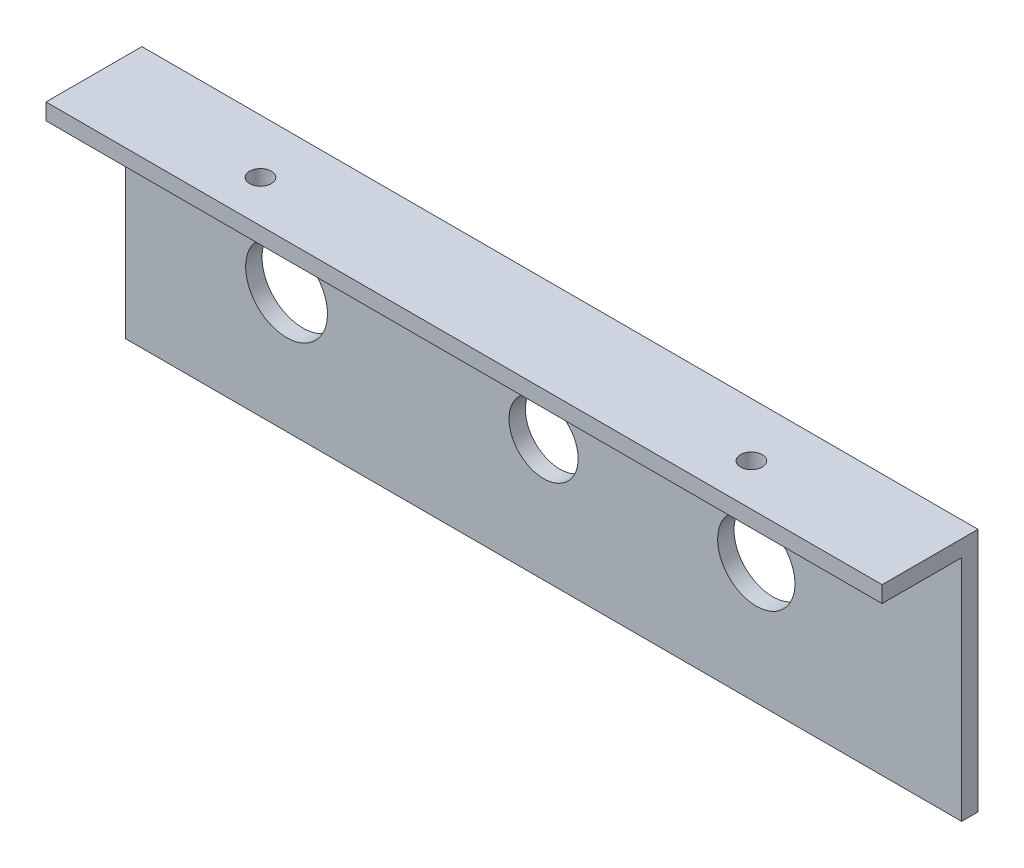
ISO-10303-21;
HEADER;
FILE_DESCRIPTION(('STEP AP214'),'2;1');
FILE_NAME('part.step','',(''),(''),'','','');
FILE_SCHEMA(('AUTOMOTIVE_DESIGN { 1 0 10303 214 1 1 1 1 }'));
ENDSEC;
DATA;
#1=APPLICATION_CONTEXT('core data for automotive mechanical design processes');
#2=APPLICATION_PROTOCOL_DEFINITION('international standard','automotive_design',2000,#1);
#3=PRODUCT_CONTEXT('',#1,'mechanical');
#4=PRODUCT('Part','Part','',(#3));
#5=PRODUCT_RELATED_PRODUCT_CATEGORY('part','',(#4));
#6=PRODUCT_DEFINITION_FORMATION('','',#4);
#7=PRODUCT_DEFINITION_CONTEXT('part definition',#1,'design');
#8=PRODUCT_DEFINITION('design','',#6,#7);
#9=PRODUCT_DEFINITION_SHAPE('','',#8);
#10=(LENGTH_UNIT() NAMED_UNIT(*) SI_UNIT(.MILLI.,.METRE.));
#11=(NAMED_UNIT(*) PLANE_ANGLE_UNIT() SI_UNIT($,.RADIAN.));
#12=(NAMED_UNIT(*) SI_UNIT($,.STERADIAN.) SOLID_ANGLE_UNIT());
#13=UNCERTAINTY_MEASURE_WITH_UNIT(LENGTH_MEASURE(1.E-05),#10,'distance_accuracy_value','');
#14=(GEOMETRIC_REPRESENTATION_CONTEXT(3) GLOBAL_UNCERTAINTY_ASSIGNED_CONTEXT((#13)) GLOBAL_UNIT_ASSIGNED_CONTEXT((#10,
#11,#12)) REPRESENTATION_CONTEXT('',''));
#15=CARTESIAN_POINT('',(0.,0.,0.));
#16=DIRECTION('',(0.,0.,1.));
#17=DIRECTION('',(1.,0.,0.));
#18=AXIS2_PLACEMENT_3D('',#15,#16,#17);
#19=CARTESIAN_POINT('',(0.,0.,2.54));
#20=DIRECTION('',(0.,0.,1.));
#21=DIRECTION('',(1.,0.,0.));
#22=AXIS2_PLACEMENT_3D('',#19,#20,#21);
#23=PLANE('',#22);
#24=CARTESIAN_POINT('',(33.02,0.,2.54));
#25=DIRECTION('',(0.,0.,-1.));
#26=DIRECTION('',(-1.,0.,0.));
#27=AXIS2_PLACEMENT_3D('',#24,#25,#26);
#28=CIRCLE('',#27,6.);
#29=CARTESIAN_POINT('',(27.02,0.,2.54));
#30=VERTEX_POINT('',#29);
#31=EDGE_CURVE('E304',#30,#30,#28,.T.);
#32=ORIENTED_EDGE('',*,*,#31,.T.);
#33=EDGE_LOOP('',(#32));
#34=FACE_BOUND('',#33,.T.);
#35=CARTESIAN_POINT('',(-39.897,0.,2.54));
#36=DIRECTION('',(0.,0.,1.));
#37=DIRECTION('',(1.,0.,0.));
#38=AXIS2_PLACEMENT_3D('',#35,#36,#37);
#39=CIRCLE('',#38,6.34999999999994);
#40=CARTESIAN_POINT('',(-33.5470000000001,0.,2.54));
#41=VERTEX_POINT('',#40);
#42=EDGE_CURVE('E135',#41,#41,#39,.T.);
#43=ORIENTED_EDGE('',*,*,#42,.F.);
#44=EDGE_LOOP('',(#43));
#45=FACE_BOUND('',#44,.T.);
#46=CARTESIAN_POINT('',(0.,0.,2.54));
#47=DIRECTION('',(0.,0.,1.));
#48=DIRECTION('',(1.,0.,0.));
#49=AXIS2_PLACEMENT_3D('',#46,#47,#48);
#50=CIRCLE('',#49,5.36575);
#51=CARTESIAN_POINT('',(5.36575,0.,2.54));
#52=VERTEX_POINT('',#51);
#53=EDGE_CURVE('E125',#52,#52,#50,.T.);
#54=ORIENTED_EDGE('',*,*,#53,.F.);
#55=EDGE_LOOP('',(#54));
#56=FACE_BOUND('',#55,.T.);
#57=DIRECTION('',(0.,-1.,0.));
#58=VECTOR('',#57,1.);
#59=CARTESIAN_POINT('',(64.897,18.9992,2.54));
#60=LINE('',#59,#58);
#61=CARTESIAN_POINT('',(64.897,16.4592,2.54));
#62=VERTEX_POINT('',#61);
#63=CARTESIAN_POINT('',(64.897,-18.9992,2.54));
#64=VERTEX_POINT('',#63);
#65=EDGE_CURVE('E65',#62,#64,#60,.T.);
#66=ORIENTED_EDGE('',*,*,#65,.F.);
#67=DIRECTION('',(-1.,0.,0.));
#68=VECTOR('',#67,1.);
#69=CARTESIAN_POINT('',(64.897,16.4592,2.54));
#70=LINE('',#69,#68);
#71=CARTESIAN_POINT('',(-64.897,16.4592,2.54));
#72=VERTEX_POINT('',#71);
#73=EDGE_CURVE('E149',#62,#72,#70,.T.);
#74=ORIENTED_EDGE('',*,*,#73,.T.);
#75=DIRECTION('',(0.,-1.,0.));
#76=VECTOR('',#75,1.);
#77=CARTESIAN_POINT('',(-64.897,18.9992,2.54));
#78=LINE('',#77,#76);
#79=CARTESIAN_POINT('',(-64.897,-18.9992,2.54));
#80=VERTEX_POINT('',#79);
#81=EDGE_CURVE('E110',#72,#80,#78,.T.);
#82=ORIENTED_EDGE('',*,*,#81,.T.);
#83=DIRECTION('',(1.,0.,0.));
#84=VECTOR('',#83,1.);
#85=CARTESIAN_POINT('',(-64.897,-18.9992,2.54));
#86=LINE('',#85,#84);
#87=EDGE_CURVE('E113',#80,#64,#86,.T.);
#88=ORIENTED_EDGE('',*,*,#87,.T.);
#89=EDGE_LOOP('',(#66,#74,#82,#88));
#90=FACE_BOUND('',#89,.T.);
#91=ADVANCED_FACE('F39',(#34,#45,#56,#90),#23,.T.);
#92=CARTESIAN_POINT('',(-64.897,18.9992,2.54));
#93=DIRECTION('',(1.,0.,0.));
#94=DIRECTION('',(0.,0.,-1.));
#95=AXIS2_PLACEMENT_3D('',#92,#93,#94);
#96=PLANE('',#95);
#97=DIRECTION('',(0.,-1.,0.));
#98=VECTOR('',#97,1.);
#99=CARTESIAN_POINT('',(-64.897,18.9992,0.));
#100=LINE('',#99,#98);
#101=CARTESIAN_POINT('',(-64.897,18.9992,0.));
#102=VERTEX_POINT('',#101);
#103=CARTESIAN_POINT('',(-64.897,-18.9992,0.));
#104=VERTEX_POINT('',#103);
#105=EDGE_CURVE('E88',#102,#104,#100,.T.);
#106=ORIENTED_EDGE('',*,*,#105,.T.);
#107=DIRECTION('',(0.,0.,-1.));
#108=VECTOR('',#107,1.);
#109=CARTESIAN_POINT('',(-64.897,-18.9992,2.54));
#110=LINE('',#109,#108);
#111=EDGE_CURVE('E11',#80,#104,#110,.T.);
#112=ORIENTED_EDGE('',*,*,#111,.F.);
#113=ORIENTED_EDGE('',*,*,#81,.F.);
#114=DIRECTION('',(0.,0.,1.));
#115=VECTOR('',#114,1.);
#116=CARTESIAN_POINT('',(-64.897,16.4592,2.54));
#117=LINE('',#116,#115);
#118=CARTESIAN_POINT('',(-64.897,16.4592,14.8844));
#119=VERTEX_POINT('',#118);
#120=EDGE_CURVE('E56',#72,#119,#117,.T.);
#121=ORIENTED_EDGE('',*,*,#120,.T.);
#122=DIRECTION('',(0.,-1.,0.));
#123=VECTOR('',#122,1.);
#124=CARTESIAN_POINT('',(-64.897,18.9992,14.8844));
#125=LINE('',#124,#123);
#126=CARTESIAN_POINT('',(-64.897,18.9992,14.8844));
#127=VERTEX_POINT('',#126);
#128=EDGE_CURVE('E91',#127,#119,#125,.T.);
#129=ORIENTED_EDGE('',*,*,#128,.F.);
#130=DIRECTION('',(0.,0.,-1.));
#131=VECTOR('',#130,1.);
#132=CARTESIAN_POINT('',(-64.897,18.9992,2.54));
#133=LINE('',#132,#131);
#134=EDGE_CURVE('E85',#127,#102,#133,.T.);
#135=ORIENTED_EDGE('',*,*,#134,.T.);
#136=EDGE_LOOP('',(#106,#112,#113,#121,#129,#135));
#137=FACE_BOUND('',#136,.T.);
#138=ADVANCED_FACE('F41',(#137),#96,.F.);
#139=CARTESIAN_POINT('',(-64.897,-18.9992,2.54));
#140=DIRECTION('',(0.,1.,0.));
#141=DIRECTION('',(0.,0.,1.));
#142=AXIS2_PLACEMENT_3D('',#139,#140,#141);
#143=PLANE('',#142);
#144=DIRECTION('',(1.,0.,0.));
#145=VECTOR('',#144,1.);
#146=CARTESIAN_POINT('',(-64.897,-18.9992,0.));
#147=LINE('',#146,#145);
#148=CARTESIAN_POINT('',(64.897,-18.9992,0.));
#149=VERTEX_POINT('',#148);
#150=EDGE_CURVE('E104',#104,#149,#147,.T.);
#151=ORIENTED_EDGE('',*,*,#150,.T.);
#152=DIRECTION('',(0.,0.,-1.));
#153=VECTOR('',#152,1.);
#154=CARTESIAN_POINT('',(64.897,-18.9992,2.54));
#155=LINE('',#154,#153);
#156=EDGE_CURVE('E48',#64,#149,#155,.T.);
#157=ORIENTED_EDGE('',*,*,#156,.F.);
#158=ORIENTED_EDGE('',*,*,#87,.F.);
#159=ORIENTED_EDGE('',*,*,#111,.T.);
#160=EDGE_LOOP('',(#151,#157,#158,#159));
#161=FACE_BOUND('',#160,.T.);
#162=ADVANCED_FACE('F159',(#161),#143,.F.);
#163=CARTESIAN_POINT('',(64.897,18.9992,2.54));
#164=DIRECTION('',(1.,0.,0.));
#165=DIRECTION('',(0.,0.,-1.));
#166=AXIS2_PLACEMENT_3D('',#163,#164,#165);
#167=PLANE('',#166);
#168=DIRECTION('',(0.,-1.,0.));
#169=VECTOR('',#168,1.);
#170=CARTESIAN_POINT('',(64.897,18.9992,0.));
#171=LINE('',#170,#169);
#172=CARTESIAN_POINT('',(64.897,18.9992,0.));
#173=VERTEX_POINT('',#172);
#174=EDGE_CURVE('E111',#173,#149,#171,.T.);
#175=ORIENTED_EDGE('',*,*,#174,.F.);
#176=DIRECTION('',(0.,0.,-1.));
#177=VECTOR('',#176,1.);
#178=CARTESIAN_POINT('',(64.897,18.9992,2.54));
#179=LINE('',#178,#177);
#180=CARTESIAN_POINT('',(64.897,18.9992,14.8844));
#181=VERTEX_POINT('',#180);
#182=EDGE_CURVE('E96',#181,#173,#179,.T.);
#183=ORIENTED_EDGE('',*,*,#182,.F.);
#184=DIRECTION('',(0.,-1.,0.));
#185=VECTOR('',#184,1.);
#186=CARTESIAN_POINT('',(64.897,18.9992,14.8844));
#187=LINE('',#186,#185);
#188=CARTESIAN_POINT('',(64.897,16.4592,14.8844));
#189=VERTEX_POINT('',#188);
#190=EDGE_CURVE('E146',#181,#189,#187,.T.);
#191=ORIENTED_EDGE('',*,*,#190,.T.);
#192=DIRECTION('',(0.,0.,1.));
#193=VECTOR('',#192,1.);
#194=CARTESIAN_POINT('',(64.897,16.4592,2.54));
#195=LINE('',#194,#193);
#196=EDGE_CURVE('E143',#62,#189,#195,.T.);
#197=ORIENTED_EDGE('',*,*,#196,.F.);
#198=ORIENTED_EDGE('',*,*,#65,.T.);
#199=ORIENTED_EDGE('',*,*,#156,.T.);
#200=EDGE_LOOP('',(#175,#183,#191,#197,#198,#199));
#201=FACE_BOUND('',#200,.T.);
#202=ADVANCED_FACE('F161',(#201),#167,.T.);
#203=CARTESIAN_POINT('',(-64.897,18.9992,2.54));
#204=DIRECTION('',(0.,1.,0.));
#205=DIRECTION('',(0.,0.,1.));
#206=AXIS2_PLACEMENT_3D('',#203,#204,#205);
#207=PLANE('',#206);
#208=CARTESIAN_POINT('',(-38.1,18.9992,8.382));
#209=DIRECTION('',(0.,1.,0.));
#210=DIRECTION('',(0.,0.,1.));
#211=AXIS2_PLACEMENT_3D('',#208,#209,#210);
#212=CIRCLE('',#211,1.68275);
#213=CARTESIAN_POINT('',(-38.1,18.9992,10.06475));
#214=VERTEX_POINT('',#213);
#215=EDGE_CURVE('E121',#214,#214,#212,.T.);
#216=ORIENTED_EDGE('',*,*,#215,.F.);
#217=EDGE_LOOP('',(#216));
#218=FACE_BOUND('',#217,.T.);
#219=CARTESIAN_POINT('',(38.1,18.9992,8.382));
#220=DIRECTION('',(0.,1.,0.));
#221=DIRECTION('',(0.,0.,1.));
#222=AXIS2_PLACEMENT_3D('',#219,#220,#221);
#223=CIRCLE('',#222,1.68275);
#224=CARTESIAN_POINT('',(38.1,18.9992,10.06475));
#225=VERTEX_POINT('',#224);
#226=EDGE_CURVE('E127',#225,#225,#223,.T.);
#227=ORIENTED_EDGE('',*,*,#226,.F.);
#228=EDGE_LOOP('',(#227));
#229=FACE_BOUND('',#228,.T.);
#230=DIRECTION('',(1.,0.,0.));
#231=VECTOR('',#230,1.);
#232=CARTESIAN_POINT('',(-64.897,18.9992,0.));
#233=LINE('',#232,#231);
#234=EDGE_CURVE('E102',#102,#173,#233,.T.);
#235=ORIENTED_EDGE('',*,*,#234,.F.);
#236=ORIENTED_EDGE('',*,*,#134,.F.);
#237=DIRECTION('',(-1.,0.,0.));
#238=VECTOR('',#237,1.);
#239=CARTESIAN_POINT('',(64.897,18.9992,14.8844));
#240=LINE('',#239,#238);
#241=EDGE_CURVE('E105',#181,#127,#240,.T.);
#242=ORIENTED_EDGE('',*,*,#241,.F.);
#243=ORIENTED_EDGE('',*,*,#182,.T.);
#244=EDGE_LOOP('',(#235,#236,#242,#243));
#245=FACE_BOUND('',#244,.T.);
#246=ADVANCED_FACE('F107',(#218,#229,#245),#207,.T.);
#247=CARTESIAN_POINT('',(0.,0.,0.));
#248=DIRECTION('',(0.,0.,1.));
#249=DIRECTION('',(1.,0.,0.));
#250=AXIS2_PLACEMENT_3D('',#247,#248,#249);
#251=PLANE('',#250);
#252=CARTESIAN_POINT('',(33.02,0.,0.));
#253=DIRECTION('',(0.,0.,-1.));
#254=DIRECTION('',(-1.,0.,0.));
#255=AXIS2_PLACEMENT_3D('',#252,#253,#254);
#256=CIRCLE('',#255,6.);
#257=CARTESIAN_POINT('',(27.02,0.,0.));
#258=VERTEX_POINT('',#257);
#259=EDGE_CURVE('E307',#258,#258,#256,.T.);
#260=ORIENTED_EDGE('',*,*,#259,.F.);
#261=EDGE_LOOP('',(#260));
#262=FACE_BOUND('',#261,.T.);
#263=CARTESIAN_POINT('',(-39.897,0.,0.));
#264=DIRECTION('',(0.,0.,1.));
#265=DIRECTION('',(1.,0.,0.));
#266=AXIS2_PLACEMENT_3D('',#263,#264,#265);
#267=CIRCLE('',#266,6.34999999999994);
#268=CARTESIAN_POINT('',(-33.5470000000001,0.,0.));
#269=VERTEX_POINT('',#268);
#270=EDGE_CURVE('E132',#269,#269,#267,.T.);
#271=ORIENTED_EDGE('',*,*,#270,.T.);
#272=EDGE_LOOP('',(#271));
#273=FACE_BOUND('',#272,.T.);
#274=CARTESIAN_POINT('',(0.,0.,0.));
#275=DIRECTION('',(0.,0.,1.));
#276=DIRECTION('',(1.,0.,0.));
#277=AXIS2_PLACEMENT_3D('',#274,#275,#276);
#278=CIRCLE('',#277,5.36575);
#279=CARTESIAN_POINT('',(5.36575,0.,0.));
#280=VERTEX_POINT('',#279);
#281=EDGE_CURVE('E138',#280,#280,#278,.T.);
#282=ORIENTED_EDGE('',*,*,#281,.T.);
#283=EDGE_LOOP('',(#282));
#284=FACE_BOUND('',#283,.T.);
#285=ORIENTED_EDGE('',*,*,#105,.F.);
#286=ORIENTED_EDGE('',*,*,#234,.T.);
#287=ORIENTED_EDGE('',*,*,#174,.T.);
#288=ORIENTED_EDGE('',*,*,#150,.F.);
#289=EDGE_LOOP('',(#285,#286,#287,#288));
#290=FACE_BOUND('',#289,.T.);
#291=ADVANCED_FACE('F100',(#262,#273,#284,#290),#251,.F.);
#292=CARTESIAN_POINT('',(64.897,18.9992,14.8844));
#293=DIRECTION('',(0.,0.,-1.));
#294=DIRECTION('',(-1.,0.,0.));
#295=AXIS2_PLACEMENT_3D('',#292,#293,#294);
#296=PLANE('',#295);
#297=ORIENTED_EDGE('',*,*,#128,.T.);
#298=DIRECTION('',(-1.,0.,0.));
#299=VECTOR('',#298,1.);
#300=CARTESIAN_POINT('',(64.897,16.4592,14.8844));
#301=LINE('',#300,#299);
#302=EDGE_CURVE('E153',#189,#119,#301,.T.);
#303=ORIENTED_EDGE('',*,*,#302,.F.);
#304=ORIENTED_EDGE('',*,*,#190,.F.);
#305=ORIENTED_EDGE('',*,*,#241,.T.);
#306=EDGE_LOOP('',(#297,#303,#304,#305));
#307=FACE_BOUND('',#306,.T.);
#308=ADVANCED_FACE('F167',(#307),#296,.F.);
#309=CARTESIAN_POINT('',(64.897,16.4592,2.54));
#310=DIRECTION('',(0.,-1.,0.));
#311=DIRECTION('',(0.,0.,-1.));
#312=AXIS2_PLACEMENT_3D('',#309,#310,#311);
#313=PLANE('',#312);
#314=CARTESIAN_POINT('',(-38.1,16.4592,8.382));
#315=DIRECTION('',(0.,-1.,0.));
#316=DIRECTION('',(0.,0.,-1.));
#317=AXIS2_PLACEMENT_3D('',#314,#315,#316);
#318=CIRCLE('',#317,1.68275);
#319=CARTESIAN_POINT('',(-38.1,16.4592,6.69925));
#320=VERTEX_POINT('',#319);
#321=EDGE_CURVE('E43',#320,#320,#318,.T.);
#322=ORIENTED_EDGE('',*,*,#321,.F.);
#323=EDGE_LOOP('',(#322));
#324=FACE_BOUND('',#323,.T.);
#325=CARTESIAN_POINT('',(38.1,16.4592,8.382));
#326=DIRECTION('',(0.,-1.,0.));
#327=DIRECTION('',(0.,0.,-1.));
#328=AXIS2_PLACEMENT_3D('',#325,#326,#327);
#329=CIRCLE('',#328,1.68275);
#330=CARTESIAN_POINT('',(38.1,16.4592,6.69925));
#331=VERTEX_POINT('',#330);
#332=EDGE_CURVE('E119',#331,#331,#329,.T.);
#333=ORIENTED_EDGE('',*,*,#332,.F.);
#334=EDGE_LOOP('',(#333));
#335=FACE_BOUND('',#334,.T.);
#336=ORIENTED_EDGE('',*,*,#120,.F.);
#337=ORIENTED_EDGE('',*,*,#73,.F.);
#338=ORIENTED_EDGE('',*,*,#196,.T.);
#339=ORIENTED_EDGE('',*,*,#302,.T.);
#340=EDGE_LOOP('',(#336,#337,#338,#339));
#341=FACE_BOUND('',#340,.T.);
#342=ADVANCED_FACE('F171',(#324,#335,#341),#313,.T.);
#343=CARTESIAN_POINT('',(0.,0.,0.));
#344=DIRECTION('',(0.,0.,1.));
#345=DIRECTION('',(1.,0.,0.));
#346=AXIS2_PLACEMENT_3D('',#343,#344,#345);
#347=CYLINDRICAL_SURFACE('',#346,5.36575);
#348=ORIENTED_EDGE('',*,*,#281,.F.);
#349=EDGE_LOOP('',(#348));
#350=FACE_BOUND('',#349,.T.);
#351=ORIENTED_EDGE('',*,*,#53,.T.);
#352=EDGE_LOOP('',(#351));
#353=FACE_BOUND('',#352,.T.);
#354=ADVANCED_FACE('F229',(#350,#353),#347,.F.);
#355=CARTESIAN_POINT('',(38.1,-18.9992,8.382));
#356=DIRECTION('',(0.,1.,0.));
#357=DIRECTION('',(0.,0.,1.));
#358=AXIS2_PLACEMENT_3D('',#355,#356,#357);
#359=CYLINDRICAL_SURFACE('',#358,1.68275);
#360=ORIENTED_EDGE('',*,*,#332,.T.);
#361=EDGE_LOOP('',(#360));
#362=FACE_BOUND('',#361,.T.);
#363=ORIENTED_EDGE('',*,*,#226,.T.);
#364=EDGE_LOOP('',(#363));
#365=FACE_BOUND('',#364,.T.);
#366=ADVANCED_FACE('F236',(#362,#365),#359,.F.);
#367=CARTESIAN_POINT('',(-38.1,-18.9992,8.382));
#368=DIRECTION('',(0.,1.,0.));
#369=DIRECTION('',(0.,0.,1.));
#370=AXIS2_PLACEMENT_3D('',#367,#368,#369);
#371=CYLINDRICAL_SURFACE('',#370,1.68275);
#372=ORIENTED_EDGE('',*,*,#321,.T.);
#373=EDGE_LOOP('',(#372));
#374=FACE_BOUND('',#373,.T.);
#375=ORIENTED_EDGE('',*,*,#215,.T.);
#376=EDGE_LOOP('',(#375));
#377=FACE_BOUND('',#376,.T.);
#378=ADVANCED_FACE('F243',(#374,#377),#371,.F.);
#379=CARTESIAN_POINT('',(-39.897,0.,0.));
#380=DIRECTION('',(0.,0.,1.));
#381=DIRECTION('',(1.,0.,0.));
#382=AXIS2_PLACEMENT_3D('',#379,#380,#381);
#383=CYLINDRICAL_SURFACE('',#382,6.34999999999994);
#384=ORIENTED_EDGE('',*,*,#270,.F.);
#385=EDGE_LOOP('',(#384));
#386=FACE_BOUND('',#385,.T.);
#387=ORIENTED_EDGE('',*,*,#42,.T.);
#388=EDGE_LOOP('',(#387));
#389=FACE_BOUND('',#388,.T.);
#390=ADVANCED_FACE('F250',(#386,#389),#383,.F.);
#391=CARTESIAN_POINT('',(33.02,0.,2.54));
#392=DIRECTION('',(0.,0.,-1.));
#393=DIRECTION('',(-1.,0.,0.));
#394=AXIS2_PLACEMENT_3D('',#391,#392,#393);
#395=CYLINDRICAL_SURFACE('',#394,6.);
#396=ORIENTED_EDGE('',*,*,#31,.F.);
#397=EDGE_LOOP('',(#396));
#398=FACE_BOUND('',#397,.T.);
#399=ORIENTED_EDGE('',*,*,#259,.T.);
#400=EDGE_LOOP('',(#399));
#401=FACE_BOUND('',#400,.T.);
#402=ADVANCED_FACE('F257',(#398,#401),#395,.F.);
#403=CLOSED_SHELL('',(#91,#138,#162,#202,#246,#291,#308,#342,#354,#366,#378,#390,#402));
#404=MANIFOLD_SOLID_BREP('B2',#403);
#405=ADVANCED_BREP_SHAPE_REPRESENTATION('',(#18,#404),#14);
#406=SHAPE_DEFINITION_REPRESENTATION(#9,#405);
ENDSEC;
END-ISO-10303-21;
